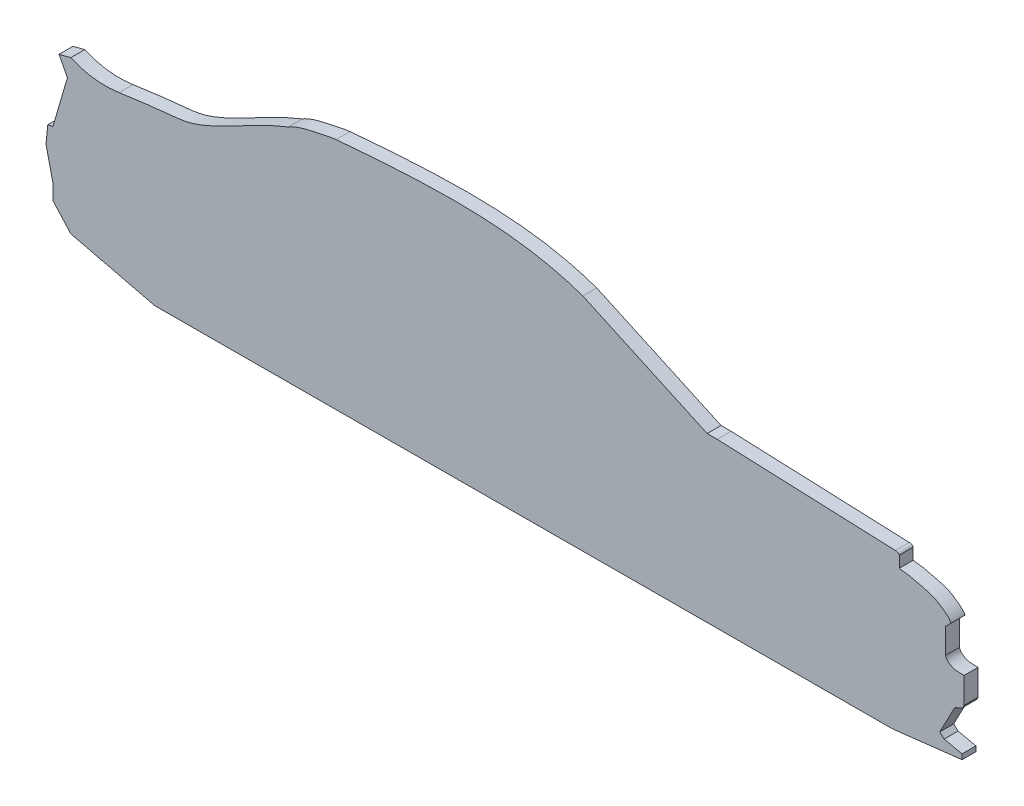
ISO-10303-21;
HEADER;
FILE_DESCRIPTION(('STEP AP214'),'2;1');
FILE_NAME('part.step','',(''),(''),'','','');
FILE_SCHEMA(('AUTOMOTIVE_DESIGN { 1 0 10303 214 1 1 1 1 }'));
ENDSEC;
DATA;
#1=APPLICATION_CONTEXT('core data for automotive mechanical design processes');
#2=APPLICATION_PROTOCOL_DEFINITION('international standard','automotive_design',2000,#1);
#3=PRODUCT_CONTEXT('',#1,'mechanical');
#4=PRODUCT('Part','Part','',(#3));
#5=PRODUCT_RELATED_PRODUCT_CATEGORY('part','',(#4));
#6=PRODUCT_DEFINITION_FORMATION('','',#4);
#7=PRODUCT_DEFINITION_CONTEXT('part definition',#1,'design');
#8=PRODUCT_DEFINITION('design','',#6,#7);
#9=PRODUCT_DEFINITION_SHAPE('','',#8);
#10=(LENGTH_UNIT() NAMED_UNIT(*) SI_UNIT(.MILLI.,.METRE.));
#11=(NAMED_UNIT(*) PLANE_ANGLE_UNIT() SI_UNIT($,.RADIAN.));
#12=(NAMED_UNIT(*) SI_UNIT($,.STERADIAN.) SOLID_ANGLE_UNIT());
#13=UNCERTAINTY_MEASURE_WITH_UNIT(LENGTH_MEASURE(1.E-05),#10,'distance_accuracy_value','');
#14=(GEOMETRIC_REPRESENTATION_CONTEXT(3) GLOBAL_UNCERTAINTY_ASSIGNED_CONTEXT((#13)) GLOBAL_UNIT_ASSIGNED_CONTEXT((#10,
#11,#12)) REPRESENTATION_CONTEXT('',''));
#15=CARTESIAN_POINT('',(0.,0.,0.));
#16=DIRECTION('',(0.,0.,1.));
#17=DIRECTION('',(1.,0.,0.));
#18=AXIS2_PLACEMENT_3D('',#15,#16,#17);
#19=CARTESIAN_POINT('',(58.7825864344325,61.387920700092,3.18));
#20=CARTESIAN_POINT('',(59.9553412007524,62.0984473264359,3.18));
#21=CARTESIAN_POINT('',(61.6811980838709,62.6757230916201,3.18));
#22=CARTESIAN_POINT('',(64.0271999588958,63.266819742886,3.18));
#23=CARTESIAN_POINT('',(66.6443782820778,63.7786861853201,3.18));
#24=CARTESIAN_POINT('',(68.8081257342653,64.309426525435,3.18));
#25=CARTESIAN_POINT('',(70.4249234095868,64.4201904919745,3.18));
#26=B_SPLINE_CURVE_WITH_KNOTS('',3,(#19,#20,#21,#22,#23,#24,#25),.UNSPECIFIED.,.F.,.F.,(4,1,1,1,
4),(0.,0.33868380467163,0.447560598695992,0.600475935578694,1.),.UNSPECIFIED.);
#27=DIRECTION('',(0.,0.,-1.));
#28=VECTOR('',#27,1.);
#29=SURFACE_OF_LINEAR_EXTRUSION('',#26,#28);
#30=CARTESIAN_POINT('',(58.7825864344325,61.387920700092,0.));
#31=CARTESIAN_POINT('',(59.9553412007524,62.0984473264359,0.));
#32=CARTESIAN_POINT('',(61.6811980838709,62.6757230916201,0.));
#33=CARTESIAN_POINT('',(64.0271999588958,63.266819742886,0.));
#34=CARTESIAN_POINT('',(66.6443782820778,63.7786861853201,0.));
#35=CARTESIAN_POINT('',(68.8081257342653,64.309426525435,0.));
#36=CARTESIAN_POINT('',(70.4249234095868,64.4201904919745,0.));
#37=B_SPLINE_CURVE_WITH_KNOTS('',3,(#30,#31,#32,#33,#34,#35,#36),.UNSPECIFIED.,.F.,.F.,(4,1,1,1,
4),(0.,0.33868380467163,0.447560598695992,0.600475935578694,1.),.UNSPECIFIED.);
#38=CARTESIAN_POINT('',(58.7825864344325,61.387920700092,0.));
#39=VERTEX_POINT('',#38);
#40=CARTESIAN_POINT('',(69.7482461927959,64.3584538222527,0.));
#41=VERTEX_POINT('',#40);
#42=EDGE_CURVE('E267',#39,#41,#37,.T.);
#43=ORIENTED_EDGE('',*,*,#42,.F.);
#44=DIRECTION('',(0.,0.,-1.));
#45=VECTOR('',#44,1.);
#46=CARTESIAN_POINT('',(58.7825864344325,61.387920700092,3.18));
#47=LINE('',#46,#45);
#48=CARTESIAN_POINT('',(58.7825864344325,61.387920700092,3.18));
#49=VERTEX_POINT('',#48);
#50=EDGE_CURVE('E11',#49,#39,#47,.T.);
#51=ORIENTED_EDGE('',*,*,#50,.F.);
#52=CARTESIAN_POINT('',(69.7482461927959,64.3584538222527,3.18));
#53=VERTEX_POINT('',#52);
#54=EDGE_CURVE('E485',#49,#53,#26,.T.);
#55=ORIENTED_EDGE('',*,*,#54,.T.);
#56=DIRECTION('',(0.,0.,-1.));
#57=VECTOR('',#56,1.);
#58=CARTESIAN_POINT('',(69.7482461927959,64.3584538222527,3.18));
#59=LINE('',#58,#57);
#60=EDGE_CURVE('E55',#53,#41,#59,.T.);
#61=ORIENTED_EDGE('',*,*,#60,.T.);
#62=EDGE_LOOP('',(#43,#51,#55,#61));
#63=FACE_BOUND('',#62,.T.);
#64=ADVANCED_FACE('F38',(#63),#29,.T.);
#65=CARTESIAN_POINT('',(20.1338269851529,48.8536857864713,3.18));
#66=CARTESIAN_POINT('',(23.9469691753332,49.4560220016771,3.18));
#67=CARTESIAN_POINT('',(28.8451837878007,49.9697702808251,3.18));
#68=CARTESIAN_POINT('',(34.0927913072582,50.5052069747191,3.18));
#69=CARTESIAN_POINT('',(36.0038570365803,50.8803667682891,3.18));
#70=CARTESIAN_POINT('',(39.5982478391194,51.9068643842101,3.18));
#71=CARTESIAN_POINT('',(47.1758600339758,55.7320148153098,3.18));
#72=CARTESIAN_POINT('',(54.0850133671124,59.5061773140621,3.18));
#73=CARTESIAN_POINT('',(58.7825864344325,61.387920700092,3.18));
#74=B_SPLINE_CURVE_WITH_KNOTS('',3,(#65,#66,#67,#68,#69,#70,#71,#72,#73),.UNSPECIFIED.,.F.,.F.,
(4,1,1,1,1,1,4),(0.,0.28145469508974,0.359726600719177,0.384533668839524,0.423485214281698,
0.632085306350574,1.),.UNSPECIFIED.);
#75=DIRECTION('',(0.,0.,-1.));
#76=VECTOR('',#75,1.);
#77=SURFACE_OF_LINEAR_EXTRUSION('',#74,#76);
#78=CARTESIAN_POINT('',(20.1338269851529,48.8536857864713,0.));
#79=CARTESIAN_POINT('',(23.9469691753332,49.4560220016771,0.));
#80=CARTESIAN_POINT('',(28.8451837878007,49.9697702808251,0.));
#81=CARTESIAN_POINT('',(34.0927913072582,50.5052069747191,0.));
#82=CARTESIAN_POINT('',(36.0038570365803,50.8803667682891,0.));
#83=CARTESIAN_POINT('',(39.5982478391194,51.9068643842101,0.));
#84=CARTESIAN_POINT('',(47.1758600339758,55.7320148153098,0.));
#85=CARTESIAN_POINT('',(54.0850133671124,59.5061773140621,0.));
#86=CARTESIAN_POINT('',(58.7825864344325,61.387920700092,0.));
#87=B_SPLINE_CURVE_WITH_KNOTS('',3,(#78,#79,#80,#81,#82,#83,#84,#85,#86),.UNSPECIFIED.,.F.,.F.,
(4,1,1,1,1,1,4),(0.,0.28145469508974,0.359726600719177,0.384533668839524,0.423485214281698,
0.632085306350574,1.),.UNSPECIFIED.);
#88=CARTESIAN_POINT('',(20.1338269851529,48.8536857864713,0.));
#89=VERTEX_POINT('',#88);
#90=EDGE_CURVE('E375',#89,#39,#87,.T.);
#91=ORIENTED_EDGE('',*,*,#90,.F.);
#92=DIRECTION('',(0.,0.,-1.));
#93=VECTOR('',#92,1.);
#94=CARTESIAN_POINT('',(20.1338269851529,48.8536857864713,3.18));
#95=LINE('',#94,#93);
#96=CARTESIAN_POINT('',(20.1338269851529,48.8536857864713,3.18));
#97=VERTEX_POINT('',#96);
#98=EDGE_CURVE('E47',#97,#89,#95,.T.);
#99=ORIENTED_EDGE('',*,*,#98,.F.);
#100=EDGE_CURVE('E489',#97,#49,#74,.T.);
#101=ORIENTED_EDGE('',*,*,#100,.T.);
#102=ORIENTED_EDGE('',*,*,#50,.T.);
#103=EDGE_LOOP('',(#91,#99,#101,#102));
#104=FACE_BOUND('',#103,.T.);
#105=ADVANCED_FACE('F376',(#104),#77,.T.);
#106=CARTESIAN_POINT('',(9.07850141008406,50.2520797955255,3.18));
#107=CARTESIAN_POINT('',(14.2515378182842,47.9791834646523,3.18));
#108=CARTESIAN_POINT('',(20.1338269851529,48.8536857864713,3.18));
#109=B_SPLINE_CURVE_WITH_KNOTS('',2,(#106,#107,#108),.UNSPECIFIED.,.F.,.F.,(3,3),(0.,1.),.UNSPECIFIED.);
#110=DIRECTION('',(0.,0.,-1.));
#111=VECTOR('',#110,1.);
#112=SURFACE_OF_LINEAR_EXTRUSION('',#109,#111);
#113=CARTESIAN_POINT('',(9.07850141008406,50.2520797955255,0.));
#114=CARTESIAN_POINT('',(14.2515378182842,47.9791834646523,0.));
#115=CARTESIAN_POINT('',(20.1338269851529,48.8536857864713,0.));
#116=B_SPLINE_CURVE_WITH_KNOTS('',2,(#113,#114,#115),.UNSPECIFIED.,.F.,.F.,(3,3),(0.,1.),.UNSPECIFIED.);
#117=CARTESIAN_POINT('',(9.07850141008405,50.2520797955255,0.));
#118=VERTEX_POINT('',#117);
#119=EDGE_CURVE('E367',#118,#89,#116,.T.);
#120=ORIENTED_EDGE('',*,*,#119,.F.);
#121=DIRECTION('',(0.,0.,-1.));
#122=VECTOR('',#121,1.);
#123=CARTESIAN_POINT('',(9.07850141008405,50.2520797955255,3.18));
#124=LINE('',#123,#122);
#125=CARTESIAN_POINT('',(9.07850141008405,50.2520797955255,3.18));
#126=VERTEX_POINT('',#125);
#127=EDGE_CURVE('E360',#126,#118,#124,.T.);
#128=ORIENTED_EDGE('',*,*,#127,.F.);
#129=EDGE_CURVE('E370',#126,#97,#109,.T.);
#130=ORIENTED_EDGE('',*,*,#129,.T.);
#131=ORIENTED_EDGE('',*,*,#98,.T.);
#132=EDGE_LOOP('',(#120,#128,#130,#131));
#133=FACE_BOUND('',#132,.T.);
#134=ADVANCED_FACE('F365',(#133),#112,.T.);
#135=CARTESIAN_POINT('',(-11.4022231375135,45.0707657578569,3.18));
#136=DIRECTION('',(-0.245258183588713,0.969457798660037,0.));
#137=DIRECTION('',(-0.969457798660037,-0.245258183588713,0.));
#138=AXIS2_PLACEMENT_3D('',#135,#136,#137);
#139=PLANE('',#138);
#140=DIRECTION('',(0.969457798660037,0.245258183588713,0.));
#141=VECTOR('',#140,1.);
#142=CARTESIAN_POINT('',(-11.4022231375135,45.0707657578569,0.));
#143=LINE('',#142,#141);
#144=CARTESIAN_POINT('',(6.38957921904648,49.5718230857474,0.));
#145=VERTEX_POINT('',#144);
#146=EDGE_CURVE('E380',#145,#118,#143,.T.);
#147=ORIENTED_EDGE('',*,*,#146,.F.);
#148=DIRECTION('',(0.,0.,-1.));
#149=VECTOR('',#148,1.);
#150=CARTESIAN_POINT('',(6.38957921904648,49.5718230857474,3.18));
#151=LINE('',#150,#149);
#152=CARTESIAN_POINT('',(6.38957921904648,49.5718230857474,3.18));
#153=VERTEX_POINT('',#152);
#154=EDGE_CURVE('E358',#153,#145,#151,.T.);
#155=ORIENTED_EDGE('',*,*,#154,.F.);
#156=DIRECTION('',(0.969457798660037,0.245258183588713,0.));
#157=VECTOR('',#156,1.);
#158=CARTESIAN_POINT('',(-11.4022231375135,45.0707657578569,3.18));
#159=LINE('',#158,#157);
#160=EDGE_CURVE('E896',#153,#126,#159,.T.);
#161=ORIENTED_EDGE('',*,*,#160,.T.);
#162=ORIENTED_EDGE('',*,*,#127,.T.);
#163=EDGE_LOOP('',(#147,#155,#161,#162));
#164=FACE_BOUND('',#163,.T.);
#165=ADVANCED_FACE('F512',(#164),#139,.T.);
#166=CARTESIAN_POINT('',(25.3008631133521,13.1295996946262,3.18));
#167=DIRECTION('',(-0.887602037197299,-0.460611141379803,0.));
#168=DIRECTION('',(0.460611141379803,-0.887602037197299,0.));
#169=AXIS2_PLACEMENT_3D('',#166,#167,#168);
#170=PLANE('',#169);
#171=DIRECTION('',(-0.460611141379803,0.887602037197299,0.));
#172=VECTOR('',#171,1.);
#173=CARTESIAN_POINT('',(25.3008631133521,13.1295996946262,0.));
#174=LINE('',#173,#172);
#175=CARTESIAN_POINT('',(8.3048699813304,45.8810396250264,0.));
#176=VERTEX_POINT('',#175);
#177=EDGE_CURVE('E382',#176,#145,#174,.T.);
#178=ORIENTED_EDGE('',*,*,#177,.F.);
#179=DIRECTION('',(0.,0.,-1.));
#180=VECTOR('',#179,1.);
#181=CARTESIAN_POINT('',(8.3048699813304,45.8810396250264,3.18));
#182=LINE('',#181,#180);
#183=CARTESIAN_POINT('',(8.3048699813304,45.8810396250264,3.18));
#184=VERTEX_POINT('',#183);
#185=EDGE_CURVE('E356',#184,#176,#182,.T.);
#186=ORIENTED_EDGE('',*,*,#185,.F.);
#187=DIRECTION('',(-0.460611141379803,0.887602037197299,0.));
#188=VECTOR('',#187,1.);
#189=CARTESIAN_POINT('',(25.3008631133521,13.1295996946262,3.18));
#190=LINE('',#189,#188);
#191=EDGE_CURVE('E893',#184,#153,#190,.T.);
#192=ORIENTED_EDGE('',*,*,#191,.T.);
#193=ORIENTED_EDGE('',*,*,#154,.T.);
#194=EDGE_LOOP('',(#178,#186,#192,#193));
#195=FACE_BOUND('',#194,.T.);
#196=ADVANCED_FACE('F515',(#195),#170,.T.);
#197=CARTESIAN_POINT('',(-4.74424207932047,1.39152209260978,3.18));
#198=DIRECTION('',(-0.959575659856589,0.281450800337808,0.));
#199=DIRECTION('',(-0.281450800337808,-0.959575659856589,0.));
#200=AXIS2_PLACEMENT_3D('',#197,#198,#199);
#201=PLANE('',#200);
#202=DIRECTION('',(0.281450800337808,0.959575659856589,0.));
#203=VECTOR('',#202,1.);
#204=CARTESIAN_POINT('',(-4.74424207932047,1.39152209260978,0.));
#205=LINE('',#204,#203);
#206=CARTESIAN_POINT('',(5.0001251964602,34.613874444493,0.));
#207=VERTEX_POINT('',#206);
#208=EDGE_CURVE('E393',#207,#176,#205,.T.);
#209=ORIENTED_EDGE('',*,*,#208,.F.);
#210=DIRECTION('',(0.,0.,-1.));
#211=VECTOR('',#210,1.);
#212=CARTESIAN_POINT('',(5.0001251964602,34.613874444493,3.18));
#213=LINE('',#212,#211);
#214=CARTESIAN_POINT('',(5.0001251964602,34.613874444493,3.18));
#215=VERTEX_POINT('',#214);
#216=EDGE_CURVE('E354',#215,#207,#213,.T.);
#217=ORIENTED_EDGE('',*,*,#216,.F.);
#218=DIRECTION('',(0.281450800337808,0.959575659856589,0.));
#219=VECTOR('',#218,1.);
#220=CARTESIAN_POINT('',(-4.74424207932047,1.39152209260978,3.18));
#221=LINE('',#220,#219);
#222=EDGE_CURVE('E890',#215,#184,#221,.T.);
#223=ORIENTED_EDGE('',*,*,#222,.T.);
#224=ORIENTED_EDGE('',*,*,#185,.T.);
#225=EDGE_LOOP('',(#209,#217,#223,#224));
#226=FACE_BOUND('',#225,.T.);
#227=ADVANCED_FACE('F519',(#226),#201,.T.);
#228=CARTESIAN_POINT('',(-7.33228996269003,31.7674085882711,3.18));
#229=DIRECTION('',(-0.224898806584016,0.974382125655579,0.));
#230=DIRECTION('',(-0.974382125655579,-0.224898806584016,0.));
#231=AXIS2_PLACEMENT_3D('',#228,#229,#230);
#232=PLANE('',#231);
#233=DIRECTION('',(0.974382125655579,0.224898806584016,0.));
#234=VECTOR('',#233,1.);
#235=CARTESIAN_POINT('',(-7.33228996269003,31.7674085882711,0.));
#236=LINE('',#235,#234);
#237=CARTESIAN_POINT('',(3.81150587652712,34.3395271843194,0.));
#238=VERTEX_POINT('',#237);
#239=EDGE_CURVE('E396',#238,#207,#236,.T.);
#240=ORIENTED_EDGE('',*,*,#239,.F.);
#241=DIRECTION('',(0.,0.,-1.));
#242=VECTOR('',#241,1.);
#243=CARTESIAN_POINT('',(3.81150587652712,34.3395271843194,3.18));
#244=LINE('',#243,#242);
#245=CARTESIAN_POINT('',(3.81150587652712,34.3395271843194,3.18));
#246=VERTEX_POINT('',#245);
#247=EDGE_CURVE('E352',#246,#238,#244,.T.);
#248=ORIENTED_EDGE('',*,*,#247,.F.);
#249=DIRECTION('',(0.974382125655579,0.224898806584016,0.));
#250=VECTOR('',#249,1.);
#251=CARTESIAN_POINT('',(-7.33228996269003,31.7674085882711,3.18));
#252=LINE('',#251,#250);
#253=EDGE_CURVE('E886',#246,#215,#252,.T.);
#254=ORIENTED_EDGE('',*,*,#253,.T.);
#255=ORIENTED_EDGE('',*,*,#216,.T.);
#256=EDGE_LOOP('',(#240,#248,#254,#255));
#257=FACE_BOUND('',#256,.T.);
#258=ADVANCED_FACE('F523',(#257),#232,.T.);
#259=CARTESIAN_POINT('',(0.39935996381265,-0.0396366379144991,3.18));
#260=DIRECTION('',(-0.995110770644322,0.0987651464215146,0.));
#261=DIRECTION('',(-0.0987651464215146,-0.995110770644322,0.));
#262=AXIS2_PLACEMENT_3D('',#259,#260,#261);
#263=PLANE('',#262);
#264=DIRECTION('',(0.0987651464215146,0.995110770644322,0.));
#265=VECTOR('',#264,1.);
#266=CARTESIAN_POINT('',(0.39935996381265,-0.0396366379144991,0.));
#267=LINE('',#266,#265);
#268=CARTESIAN_POINT('',(3.40814163254777,30.2754203792368,0.));
#269=VERTEX_POINT('',#268);
#270=EDGE_CURVE('E399',#269,#238,#267,.T.);
#271=ORIENTED_EDGE('',*,*,#270,.F.);
#272=DIRECTION('',(0.,0.,-1.));
#273=VECTOR('',#272,1.);
#274=CARTESIAN_POINT('',(3.40814163254777,30.2754203792368,3.18));
#275=LINE('',#274,#273);
#276=CARTESIAN_POINT('',(3.40814163254777,30.2754203792368,3.18));
#277=VERTEX_POINT('',#276);
#278=EDGE_CURVE('E350',#277,#269,#275,.T.);
#279=ORIENTED_EDGE('',*,*,#278,.F.);
#280=DIRECTION('',(0.0987651464215146,0.995110770644322,0.));
#281=VECTOR('',#280,1.);
#282=CARTESIAN_POINT('',(0.39935996381265,-0.0396366379144991,3.18));
#283=LINE('',#282,#281);
#284=EDGE_CURVE('E901',#277,#246,#283,.T.);
#285=ORIENTED_EDGE('',*,*,#284,.T.);
#286=ORIENTED_EDGE('',*,*,#247,.T.);
#287=EDGE_LOOP('',(#271,#279,#285,#286));
#288=FACE_BOUND('',#287,.T.);
#289=ADVANCED_FACE('F527',(#288),#263,.T.);
#290=CARTESIAN_POINT('',(9.8702358402127,2.27816603231829,3.18));
#291=DIRECTION('',(-0.974382125655579,-0.224898806584017,0.));
#292=DIRECTION('',(0.224898806584017,-0.974382125655579,0.));
#293=AXIS2_PLACEMENT_3D('',#290,#291,#292);
#294=PLANE('',#293);
#295=DIRECTION('',(-0.224898806584017,0.974382125655579,0.));
#296=VECTOR('',#295,1.);
#297=CARTESIAN_POINT('',(9.8702358402127,2.27816603231829,0.));
#298=LINE('',#297,#296);
#299=CARTESIAN_POINT('',(5.0001251964602,23.378094632716,0.));
#300=VERTEX_POINT('',#299);
#301=EDGE_CURVE('E402',#300,#269,#298,.T.);
#302=ORIENTED_EDGE('',*,*,#301,.F.);
#303=DIRECTION('',(0.,0.,-1.));
#304=VECTOR('',#303,1.);
#305=CARTESIAN_POINT('',(5.0001251964602,23.378094632716,3.18));
#306=LINE('',#305,#304);
#307=CARTESIAN_POINT('',(5.0001251964602,23.378094632716,3.18));
#308=VERTEX_POINT('',#307);
#309=EDGE_CURVE('E348',#308,#300,#306,.T.);
#310=ORIENTED_EDGE('',*,*,#309,.F.);
#311=DIRECTION('',(-0.224898806584017,0.974382125655579,0.));
#312=VECTOR('',#311,1.);
#313=CARTESIAN_POINT('',(9.8702358402127,2.27816603231829,3.18));
#314=LINE('',#313,#312);
#315=EDGE_CURVE('E879',#308,#277,#314,.T.);
#316=ORIENTED_EDGE('',*,*,#315,.T.);
#317=ORIENTED_EDGE('',*,*,#278,.T.);
#318=EDGE_LOOP('',(#302,#310,#316,#317));
#319=FACE_BOUND('',#318,.T.);
#320=ADVANCED_FACE('F531',(#319),#294,.T.);
#321=CARTESIAN_POINT('',(5.0001251964602,0.,3.18));
#322=DIRECTION('',(-1.,0.,0.));
#323=DIRECTION('',(0.,0.,1.));
#324=AXIS2_PLACEMENT_3D('',#321,#322,#323);
#325=PLANE('',#324);
#326=DIRECTION('',(0.,1.,0.));
#327=VECTOR('',#326,1.);
#328=CARTESIAN_POINT('',(5.0001251964602,0.,0.));
#329=LINE('',#328,#327);
#330=CARTESIAN_POINT('',(5.0001251964602,19.8805754375613,0.));
#331=VERTEX_POINT('',#330);
#332=EDGE_CURVE('E405',#331,#300,#329,.T.);
#333=ORIENTED_EDGE('',*,*,#332,.F.);
#334=DIRECTION('',(0.,0.,-1.));
#335=VECTOR('',#334,1.);
#336=CARTESIAN_POINT('',(5.0001251964602,19.8805754375613,3.18));
#337=LINE('',#336,#335);
#338=CARTESIAN_POINT('',(5.0001251964602,19.8805754375613,3.18));
#339=VERTEX_POINT('',#338);
#340=EDGE_CURVE('E346',#339,#331,#337,.T.);
#341=ORIENTED_EDGE('',*,*,#340,.F.);
#342=DIRECTION('',(0.,1.,0.));
#343=VECTOR('',#342,1.);
#344=CARTESIAN_POINT('',(5.0001251964602,0.,3.18));
#345=LINE('',#344,#343);
#346=EDGE_CURVE('E875',#339,#308,#345,.T.);
#347=ORIENTED_EDGE('',*,*,#346,.T.);
#348=ORIENTED_EDGE('',*,*,#309,.T.);
#349=EDGE_LOOP('',(#333,#341,#347,#348));
#350=FACE_BOUND('',#349,.T.);
#351=ADVANCED_FACE('F535',(#350),#325,.T.);
#352=CARTESIAN_POINT('',(12.6408905487857,11.4313415087027,3.18));
#353=DIRECTION('',(-0.741700823334496,-0.67073086157186,0.));
#354=DIRECTION('',(0.67073086157186,-0.741700823334496,0.));
#355=AXIS2_PLACEMENT_3D('',#352,#353,#354);
#356=PLANE('',#355);
#357=DIRECTION('',(-0.67073086157186,0.741700823334496,0.));
#358=VECTOR('',#357,1.);
#359=CARTESIAN_POINT('',(12.6408905487857,11.4313415087027,0.));
#360=LINE('',#359,#358);
#361=CARTESIAN_POINT('',(9.07850141008406,15.3706666666667,0.));
#362=VERTEX_POINT('',#361);
#363=EDGE_CURVE('E408',#362,#331,#360,.T.);
#364=ORIENTED_EDGE('',*,*,#363,.F.);
#365=DIRECTION('',(0.,0.,-1.));
#366=VECTOR('',#365,1.);
#367=CARTESIAN_POINT('',(9.07850141008406,15.3706666666667,3.18));
#368=LINE('',#367,#366);
#369=CARTESIAN_POINT('',(9.07850141008406,15.3706666666667,3.18));
#370=VERTEX_POINT('',#369);
#371=EDGE_CURVE('E344',#370,#362,#368,.T.);
#372=ORIENTED_EDGE('',*,*,#371,.F.);
#373=DIRECTION('',(-0.67073086157186,0.741700823334496,0.));
#374=VECTOR('',#373,1.);
#375=CARTESIAN_POINT('',(12.6408905487857,11.4313415087027,3.18));
#376=LINE('',#375,#374);
#377=EDGE_CURVE('E905',#370,#339,#376,.T.);
#378=ORIENTED_EDGE('',*,*,#377,.T.);
#379=ORIENTED_EDGE('',*,*,#340,.T.);
#380=EDGE_LOOP('',(#364,#372,#378,#379));
#381=FACE_BOUND('',#380,.T.);
#382=ADVANCED_FACE('F539',(#381),#356,.T.);
#383=CARTESIAN_POINT('',(4.00938908371914,16.5953497233249,3.18));
#384=DIRECTION('',(-0.234840611414298,-0.972033892017433,0.));
#385=DIRECTION('',(0.972033892017433,-0.234840611414299,0.));
#386=AXIS2_PLACEMENT_3D('',#383,#384,#385);
#387=PLANE('',#386);
#388=DIRECTION('',(-0.972033892017433,0.234840611414298,0.));
#389=VECTOR('',#388,1.);
#390=CARTESIAN_POINT('',(4.00938908371914,16.5953497233249,0.));
#391=LINE('',#390,#389);
#392=CARTESIAN_POINT('',(28.2441986415733,10.7402889679191,0.));
#393=VERTEX_POINT('',#392);
#394=EDGE_CURVE('E411',#393,#362,#391,.T.);
#395=ORIENTED_EDGE('',*,*,#394,.F.);
#396=DIRECTION('',(0.,0.,-1.));
#397=VECTOR('',#396,1.);
#398=CARTESIAN_POINT('',(28.2441986415733,10.7402889679191,3.18));
#399=LINE('',#398,#397);
#400=CARTESIAN_POINT('',(28.2441986415733,10.7402889679191,3.18));
#401=VERTEX_POINT('',#400);
#402=EDGE_CURVE('E342',#401,#393,#399,.T.);
#403=ORIENTED_EDGE('',*,*,#402,.F.);
#404=DIRECTION('',(-0.972033892017433,0.234840611414298,0.));
#405=VECTOR('',#404,1.);
#406=CARTESIAN_POINT('',(4.00938908371914,16.5953497233249,3.18));
#407=LINE('',#406,#405);
#408=EDGE_CURVE('E868',#401,#370,#407,.T.);
#409=ORIENTED_EDGE('',*,*,#408,.T.);
#410=ORIENTED_EDGE('',*,*,#371,.T.);
#411=EDGE_LOOP('',(#395,#403,#409,#410));
#412=FACE_BOUND('',#411,.T.);
#413=ADVANCED_FACE('F543',(#412),#387,.T.);
#414=CARTESIAN_POINT('',(-0.0344172000520098,10.6488925362904,3.18));
#415=DIRECTION('',(-0.00323198118286353,0.999994777135178,0.));
#416=DIRECTION('',(-0.999994777135178,-0.00323198118286353,0.));
#417=AXIS2_PLACEMENT_3D('',#414,#415,#416);
#418=PLANE('',#417);
#419=DIRECTION('',(0.999994777135178,0.00323198118286353,0.));
#420=VECTOR('',#419,1.);
#421=CARTESIAN_POINT('',(-0.0344172000520098,10.6488925362904,0.));
#422=LINE('',#421,#420);
#423=CARTESIAN_POINT('',(196.984326140587,11.2856567331721,0.));
#424=VERTEX_POINT('',#423);
#425=EDGE_CURVE('E414',#393,#424,#422,.T.);
#426=ORIENTED_EDGE('',*,*,#425,.T.);
#427=DIRECTION('',(0.,0.,-1.));
#428=VECTOR('',#427,1.);
#429=CARTESIAN_POINT('',(196.984326140587,11.2856567331721,3.18));
#430=LINE('',#429,#428);
#431=CARTESIAN_POINT('',(196.984326140587,11.2856567331721,3.18));
#432=VERTEX_POINT('',#431);
#433=EDGE_CURVE('E340',#432,#424,#430,.T.);
#434=ORIENTED_EDGE('',*,*,#433,.F.);
#435=DIRECTION('',(0.999994777135178,0.00323198118286353,0.));
#436=VECTOR('',#435,1.);
#437=CARTESIAN_POINT('',(-0.0344172000520098,10.6488925362904,3.18));
#438=LINE('',#437,#436);
#439=EDGE_CURVE('E908',#401,#432,#438,.T.);
#440=ORIENTED_EDGE('',*,*,#439,.F.);
#441=ORIENTED_EDGE('',*,*,#402,.T.);
#442=EDGE_LOOP('',(#426,#434,#440,#441));
#443=FACE_BOUND('',#442,.T.);
#444=ADVANCED_FACE('F547',(#443),#418,.F.);
#445=CARTESIAN_POINT('',(1.31162485116349,-11.3421853125444,3.18));
#446=DIRECTION('',(0.114875721901543,-0.993379871206176,0.));
#447=DIRECTION('',(0.993379871206176,0.114875721901543,0.));
#448=AXIS2_PLACEMENT_3D('',#445,#446,#447);
#449=PLANE('',#448);
#450=DIRECTION('',(-0.993379871206176,-0.114875721901543,0.));
#451=VECTOR('',#450,1.);
#452=CARTESIAN_POINT('',(1.31162485116349,-11.3421853125444,0.));
#453=LINE('',#452,#451);
#454=CARTESIAN_POINT('',(212.842666666667,13.1195355633138,0.));
#455=VERTEX_POINT('',#454);
#456=EDGE_CURVE('E417',#455,#424,#453,.T.);
#457=ORIENTED_EDGE('',*,*,#456,.F.);
#458=DIRECTION('',(0.,0.,-1.));
#459=VECTOR('',#458,1.);
#460=CARTESIAN_POINT('',(212.842666666667,13.1195355633138,3.18));
#461=LINE('',#460,#459);
#462=CARTESIAN_POINT('',(212.842666666667,13.1195355633138,3.18));
#463=VERTEX_POINT('',#462);
#464=EDGE_CURVE('E338',#463,#455,#461,.T.);
#465=ORIENTED_EDGE('',*,*,#464,.F.);
#466=DIRECTION('',(-0.993379871206176,-0.114875721901543,0.));
#467=VECTOR('',#466,1.);
#468=CARTESIAN_POINT('',(1.31162485116349,-11.3421853125444,3.18));
#469=LINE('',#468,#467);
#470=EDGE_CURVE('E910',#463,#432,#469,.T.);
#471=ORIENTED_EDGE('',*,*,#470,.T.);
#472=ORIENTED_EDGE('',*,*,#433,.T.);
#473=EDGE_LOOP('',(#457,#465,#471,#472));
#474=FACE_BOUND('',#473,.T.);
#475=ADVANCED_FACE('F551',(#474),#449,.T.);
#476=CARTESIAN_POINT('',(212.842666666667,0.,3.18));
#477=DIRECTION('',(1.,0.,0.));
#478=DIRECTION('',(0.,0.,-1.));
#479=AXIS2_PLACEMENT_3D('',#476,#477,#478);
#480=PLANE('',#479);
#481=DIRECTION('',(0.,-1.,0.));
#482=VECTOR('',#481,1.);
#483=CARTESIAN_POINT('',(212.842666666667,0.,0.));
#484=LINE('',#483,#482);
#485=CARTESIAN_POINT('',(212.842666666667,14.2784446215667,0.));
#486=VERTEX_POINT('',#485);
#487=EDGE_CURVE('E420',#486,#455,#484,.T.);
#488=ORIENTED_EDGE('',*,*,#487,.F.);
#489=DIRECTION('',(0.,0.,-1.));
#490=VECTOR('',#489,1.);
#491=CARTESIAN_POINT('',(212.842666666667,14.2784446215667,3.18));
#492=LINE('',#491,#490);
#493=CARTESIAN_POINT('',(212.842666666667,14.2784446215667,3.18));
#494=VERTEX_POINT('',#493);
#495=EDGE_CURVE('E336',#494,#486,#492,.T.);
#496=ORIENTED_EDGE('',*,*,#495,.F.);
#497=DIRECTION('',(0.,-1.,0.));
#498=VECTOR('',#497,1.);
#499=CARTESIAN_POINT('',(212.842666666667,0.,3.18));
#500=LINE('',#499,#498);
#501=EDGE_CURVE('E858',#494,#463,#500,.T.);
#502=ORIENTED_EDGE('',*,*,#501,.T.);
#503=ORIENTED_EDGE('',*,*,#464,.T.);
#504=EDGE_LOOP('',(#488,#496,#502,#503));
#505=FACE_BOUND('',#504,.T.);
#506=ADVANCED_FACE('F555',(#505),#480,.T.);
#507=CARTESIAN_POINT('',(12.5495173195074,57.780616860239,3.18));
#508=DIRECTION('',(0.212244143676169,0.977216671713684,0.));
#509=DIRECTION('',(-0.977216671713684,0.212244143676169,0.));
#510=AXIS2_PLACEMENT_3D('',#507,#508,#509);
#511=PLANE('',#510);
#512=DIRECTION('',(0.977216671713684,-0.212244143676169,0.));
#513=VECTOR('',#512,1.);
#514=CARTESIAN_POINT('',(12.5495173195074,57.780616860239,0.));
#515=LINE('',#514,#513);
#516=CARTESIAN_POINT('',(208.75316699302,15.1666533284188,0.));
#517=VERTEX_POINT('',#516);
#518=EDGE_CURVE('E423',#517,#486,#515,.T.);
#519=ORIENTED_EDGE('',*,*,#518,.F.);
#520=DIRECTION('',(0.,0.,-1.));
#521=VECTOR('',#520,1.);
#522=CARTESIAN_POINT('',(208.75316699302,15.1666533284188,3.18));
#523=LINE('',#522,#521);
#524=CARTESIAN_POINT('',(208.75316699302,15.1666533284188,3.18));
#525=VERTEX_POINT('',#524);
#526=EDGE_CURVE('E334',#525,#517,#523,.T.);
#527=ORIENTED_EDGE('',*,*,#526,.F.);
#528=DIRECTION('',(0.977216671713684,-0.212244143676169,0.));
#529=VECTOR('',#528,1.);
#530=CARTESIAN_POINT('',(12.5495173195074,57.780616860239,3.18));
#531=LINE('',#530,#529);
#532=EDGE_CURVE('E854',#525,#494,#531,.T.);
#533=ORIENTED_EDGE('',*,*,#532,.T.);
#534=ORIENTED_EDGE('',*,*,#495,.T.);
#535=EDGE_LOOP('',(#519,#527,#533,#534));
#536=FACE_BOUND('',#535,.T.);
#537=ADVANCED_FACE('F559',(#536),#511,.T.);
#538=CARTESIAN_POINT('',(104.505471970564,112.234945922878,3.18));
#539=DIRECTION('',(0.681456485667931,0.731858632620476,0.));
#540=DIRECTION('',(-0.731858632620476,0.681456485667931,0.));
#541=AXIS2_PLACEMENT_3D('',#538,#539,#540);
#542=PLANE('',#541);
#543=DIRECTION('',(0.731858632620476,-0.681456485667931,0.));
#544=VECTOR('',#543,1.);
#545=CARTESIAN_POINT('',(104.505471970564,112.234945922878,0.));
#546=LINE('',#545,#544);
#547=CARTESIAN_POINT('',(207.756612292284,16.0945766101434,0.));
#548=VERTEX_POINT('',#547);
#549=EDGE_CURVE('E426',#548,#517,#546,.T.);
#550=ORIENTED_EDGE('',*,*,#549,.F.);
#551=DIRECTION('',(0.,0.,-1.));
#552=VECTOR('',#551,1.);
#553=CARTESIAN_POINT('',(207.756612292284,16.0945766101434,3.18));
#554=LINE('',#553,#552);
#555=CARTESIAN_POINT('',(207.756612292284,16.0945766101434,3.18));
#556=VERTEX_POINT('',#555);
#557=EDGE_CURVE('E332',#556,#548,#554,.T.);
#558=ORIENTED_EDGE('',*,*,#557,.F.);
#559=DIRECTION('',(0.731858632620476,-0.681456485667931,0.));
#560=VECTOR('',#559,1.);
#561=CARTESIAN_POINT('',(104.505471970564,112.234945922878,3.18));
#562=LINE('',#561,#560);
#563=EDGE_CURVE('E913',#556,#525,#562,.T.);
#564=ORIENTED_EDGE('',*,*,#563,.T.);
#565=ORIENTED_EDGE('',*,*,#526,.T.);
#566=EDGE_LOOP('',(#550,#558,#564,#565));
#567=FACE_BOUND('',#566,.T.);
#568=ADVANCED_FACE('F563',(#567),#542,.T.);
#569=CARTESIAN_POINT('',(156.25749658546,-82.0186972043212,3.18));
#570=DIRECTION('',(0.885436353142067,-0.464760652954268,0.));
#571=DIRECTION('',(0.464760652954268,0.885436353142067,0.));
#572=AXIS2_PLACEMENT_3D('',#569,#570,#571);
#573=PLANE('',#572);
#574=DIRECTION('',(-0.464760652954268,-0.885436353142067,0.));
#575=VECTOR('',#574,1.);
#576=CARTESIAN_POINT('',(156.25749658546,-82.0186972043212,0.));
#577=LINE('',#576,#575);
#578=CARTESIAN_POINT('',(211.015778832319,22.3037608798276,0.));
#579=VERTEX_POINT('',#578);
#580=EDGE_CURVE('E429',#579,#548,#577,.T.);
#581=ORIENTED_EDGE('',*,*,#580,.F.);
#582=DIRECTION('',(0.,0.,-1.));
#583=VECTOR('',#582,1.);
#584=CARTESIAN_POINT('',(211.015778832319,22.3037608798276,3.18));
#585=LINE('',#584,#583);
#586=CARTESIAN_POINT('',(211.015778832319,22.3037608798276,3.18));
#587=VERTEX_POINT('',#586);
#588=EDGE_CURVE('E330',#587,#579,#585,.T.);
#589=ORIENTED_EDGE('',*,*,#588,.F.);
#590=DIRECTION('',(-0.464760652954268,-0.885436353142067,0.));
#591=VECTOR('',#590,1.);
#592=CARTESIAN_POINT('',(156.25749658546,-82.0186972043212,3.18));
#593=LINE('',#592,#591);
#594=EDGE_CURVE('E587',#587,#556,#593,.T.);
#595=ORIENTED_EDGE('',*,*,#594,.T.);
#596=ORIENTED_EDGE('',*,*,#557,.T.);
#597=EDGE_LOOP('',(#581,#589,#595,#596));
#598=FACE_BOUND('',#597,.T.);
#599=ADVANCED_FACE('F567',(#598),#573,.T.);
#600=CARTESIAN_POINT('',(213.311956775186,24.1360942269111,3.18));
#601=CARTESIAN_POINT('',(213.208583454964,23.8622220482375,3.18));
#602=CARTESIAN_POINT('',(212.95727908795,23.3800627355938,3.18));
#603=CARTESIAN_POINT('',(212.308333510234,23.0293374411312,3.18));
#604=CARTESIAN_POINT('',(211.606742708366,22.8604329825108,3.18));
#605=CARTESIAN_POINT('',(211.18355106596,22.6233912826359,3.18));
#606=CARTESIAN_POINT('',(211.015778832319,22.3037608798275,3.18));
#607=B_SPLINE_CURVE_WITH_KNOTS('',3,(#600,#601,#602,#603,#604,#605,#606),.UNSPECIFIED.,.F.,.F.,
(4,1,1,1,4),(0.,0.295149858496401,0.505508593038205,0.7072139325662,1.),.UNSPECIFIED.);
#608=DIRECTION('',(0.,0.,-1.));
#609=VECTOR('',#608,1.);
#610=SURFACE_OF_LINEAR_EXTRUSION('',#607,#609);
#611=CARTESIAN_POINT('',(213.311956775186,24.1360942269111,0.));
#612=CARTESIAN_POINT('',(213.208583454964,23.8622220482375,0.));
#613=CARTESIAN_POINT('',(212.95727908795,23.3800627355938,0.));
#614=CARTESIAN_POINT('',(212.308333510234,23.0293374411312,0.));
#615=CARTESIAN_POINT('',(211.606742708366,22.8604329825108,0.));
#616=CARTESIAN_POINT('',(211.18355106596,22.6233912826359,0.));
#617=CARTESIAN_POINT('',(211.015778832319,22.3037608798275,0.));
#618=B_SPLINE_CURVE_WITH_KNOTS('',3,(#611,#612,#613,#614,#615,#616,#617),.UNSPECIFIED.,.F.,.F.,
(4,1,1,1,4),(0.,0.295149858496401,0.505508593038205,0.7072139325662,1.),.UNSPECIFIED.);
#619=CARTESIAN_POINT('',(213.311956775186,24.1360942269111,0.));
#620=VERTEX_POINT('',#619);
#621=EDGE_CURVE('E432',#620,#579,#618,.T.);
#622=ORIENTED_EDGE('',*,*,#621,.F.);
#623=DIRECTION('',(0.,0.,-1.));
#624=VECTOR('',#623,1.);
#625=CARTESIAN_POINT('',(213.311956775186,24.1360942269111,3.18));
#626=LINE('',#625,#624);
#627=CARTESIAN_POINT('',(213.311956775186,24.1360942269111,3.18));
#628=VERTEX_POINT('',#627);
#629=EDGE_CURVE('E328',#628,#620,#626,.T.);
#630=ORIENTED_EDGE('',*,*,#629,.F.);
#631=EDGE_CURVE('E579',#628,#587,#607,.T.);
#632=ORIENTED_EDGE('',*,*,#631,.T.);
#633=ORIENTED_EDGE('',*,*,#588,.T.);
#634=EDGE_LOOP('',(#622,#630,#632,#633));
#635=FACE_BOUND('',#634,.T.);
#636=ADVANCED_FACE('F571',(#635),#610,.T.);
#637=CARTESIAN_POINT('',(213.311956775186,0.,3.18));
#638=DIRECTION('',(1.,0.,0.));
#639=DIRECTION('',(0.,0.,-1.));
#640=AXIS2_PLACEMENT_3D('',#637,#638,#639);
#641=PLANE('',#640);
#642=DIRECTION('',(0.,-1.,0.));
#643=VECTOR('',#642,1.);
#644=CARTESIAN_POINT('',(213.311956775186,0.,0.));
#645=LINE('',#644,#643);
#646=CARTESIAN_POINT('',(213.311956775186,30.0524315911694,0.));
#647=VERTEX_POINT('',#646);
#648=EDGE_CURVE('E437',#647,#620,#645,.T.);
#649=ORIENTED_EDGE('',*,*,#648,.F.);
#650=DIRECTION('',(0.,0.,-1.));
#651=VECTOR('',#650,1.);
#652=CARTESIAN_POINT('',(213.311956775186,30.0524315911694,3.18));
#653=LINE('',#652,#651);
#654=CARTESIAN_POINT('',(213.311956775186,30.0524315911694,3.18));
#655=VERTEX_POINT('',#654);
#656=EDGE_CURVE('E326',#655,#647,#653,.T.);
#657=ORIENTED_EDGE('',*,*,#656,.F.);
#658=DIRECTION('',(0.,-1.,0.));
#659=VECTOR('',#658,1.);
#660=CARTESIAN_POINT('',(213.311956775186,0.,3.18));
#661=LINE('',#660,#659);
#662=EDGE_CURVE('E586',#655,#628,#661,.T.);
#663=ORIENTED_EDGE('',*,*,#662,.T.);
#664=ORIENTED_EDGE('',*,*,#629,.T.);
#665=EDGE_LOOP('',(#649,#657,#663,#664));
#666=FACE_BOUND('',#665,.T.);
#667=ADVANCED_FACE('F576',(#666),#641,.T.);
#668=CARTESIAN_POINT('',(209.096417687576,31.9069341091698,3.18));
#669=CARTESIAN_POINT('',(209.232301931015,31.1984936876893,3.18));
#670=CARTESIAN_POINT('',(209.920582822117,30.6804375276798,3.18));
#671=CARTESIAN_POINT('',(211.427560223815,29.9869430499981,3.18));
#672=CARTESIAN_POINT('',(212.520853082694,30.0887624337777,3.18));
#673=CARTESIAN_POINT('',(213.311956775186,30.0524315911694,3.18));
#674=B_SPLINE_CURVE_WITH_KNOTS('',3,(#668,#669,#670,#671,#672,#673),.UNSPECIFIED.,.F.,.F.,(4,1,
1,4),(0.,0.389815245761473,0.499049523534849,1.),.UNSPECIFIED.);
#675=DIRECTION('',(0.,0.,-1.));
#676=VECTOR('',#675,1.);
#677=SURFACE_OF_LINEAR_EXTRUSION('',#674,#676);
#678=CARTESIAN_POINT('',(209.096417687576,31.9069341091698,0.));
#679=CARTESIAN_POINT('',(209.232301931015,31.1984936876893,0.));
#680=CARTESIAN_POINT('',(209.920582822117,30.6804375276798,0.));
#681=CARTESIAN_POINT('',(211.427560223815,29.9869430499981,0.));
#682=CARTESIAN_POINT('',(212.520853082694,30.0887624337777,0.));
#683=CARTESIAN_POINT('',(213.311956775186,30.0524315911694,0.));
#684=B_SPLINE_CURVE_WITH_KNOTS('',3,(#678,#679,#680,#681,#682,#683),.UNSPECIFIED.,.F.,.F.,(4,1,
1,4),(0.,0.389815245761473,0.499049523534849,1.),.UNSPECIFIED.);
#685=CARTESIAN_POINT('',(209.096417687576,31.9069341091698,0.));
#686=VERTEX_POINT('',#685);
#687=EDGE_CURVE('E443',#686,#647,#684,.T.);
#688=ORIENTED_EDGE('',*,*,#687,.F.);
#689=DIRECTION('',(0.,0.,-1.));
#690=VECTOR('',#689,1.);
#691=CARTESIAN_POINT('',(209.096417687576,31.9069341091698,3.18));
#692=LINE('',#691,#690);
#693=CARTESIAN_POINT('',(209.096417687576,31.9069341091698,3.18));
#694=VERTEX_POINT('',#693);
#695=EDGE_CURVE('E324',#694,#686,#692,.T.);
#696=ORIENTED_EDGE('',*,*,#695,.F.);
#697=EDGE_CURVE('E594',#694,#655,#674,.T.);
#698=ORIENTED_EDGE('',*,*,#697,.T.);
#699=ORIENTED_EDGE('',*,*,#656,.T.);
#700=EDGE_LOOP('',(#688,#696,#698,#699));
#701=FACE_BOUND('',#700,.T.);
#702=ADVANCED_FACE('F605',(#701),#677,.T.);
#703=CARTESIAN_POINT('',(209.096417687576,0.,3.18));
#704=DIRECTION('',(1.,0.,0.));
#705=DIRECTION('',(0.,0.,-1.));
#706=AXIS2_PLACEMENT_3D('',#703,#704,#705);
#707=PLANE('',#706);
#708=DIRECTION('',(0.,-1.,0.));
#709=VECTOR('',#708,1.);
#710=CARTESIAN_POINT('',(209.096417687576,0.,0.));
#711=LINE('',#710,#709);
#712=CARTESIAN_POINT('',(209.096417687576,37.6721265369038,0.));
#713=VERTEX_POINT('',#712);
#714=EDGE_CURVE('E448',#713,#686,#711,.T.);
#715=ORIENTED_EDGE('',*,*,#714,.F.);
#716=DIRECTION('',(0.,0.,-1.));
#717=VECTOR('',#716,1.);
#718=CARTESIAN_POINT('',(209.096417687576,37.6721265369038,3.18));
#719=LINE('',#718,#717);
#720=CARTESIAN_POINT('',(209.096417687576,37.6721265369038,3.18));
#721=VERTEX_POINT('',#720);
#722=EDGE_CURVE('E322',#721,#713,#719,.T.);
#723=ORIENTED_EDGE('',*,*,#722,.F.);
#724=DIRECTION('',(0.,-1.,0.));
#725=VECTOR('',#724,1.);
#726=CARTESIAN_POINT('',(209.096417687576,0.,3.18));
#727=LINE('',#726,#725);
#728=EDGE_CURVE('E600',#721,#694,#727,.T.);
#729=ORIENTED_EDGE('',*,*,#728,.T.);
#730=ORIENTED_EDGE('',*,*,#695,.T.);
#731=EDGE_LOOP('',(#715,#723,#729,#730));
#732=FACE_BOUND('',#731,.T.);
#733=ADVANCED_FACE('F608',(#732),#707,.T.);
#734=CARTESIAN_POINT('',(85.7121455753372,-85.7121455753363,3.18));
#735=DIRECTION('',(0.707106781186551,-0.707106781186544,0.));
#736=DIRECTION('',(0.707106781186544,0.707106781186551,0.));
#737=AXIS2_PLACEMENT_3D('',#734,#735,#736);
#738=PLANE('',#737);
#739=DIRECTION('',(-0.707106781186544,-0.707106781186551,0.));
#740=VECTOR('',#739,1.);
#741=CARTESIAN_POINT('',(85.7121455753372,-85.7121455753363,0.));
#742=LINE('',#741,#740);
#743=CARTESIAN_POINT('',(210.346467513773,38.9221763631009,0.));
#744=VERTEX_POINT('',#743);
#745=EDGE_CURVE('E454',#744,#713,#742,.T.);
#746=ORIENTED_EDGE('',*,*,#745,.F.);
#747=DIRECTION('',(0.,0.,-1.));
#748=VECTOR('',#747,1.);
#749=CARTESIAN_POINT('',(210.346467513773,38.9221763631009,3.18));
#750=LINE('',#749,#748);
#751=CARTESIAN_POINT('',(210.346467513773,38.9221763631009,3.18));
#752=VERTEX_POINT('',#751);
#753=EDGE_CURVE('E320',#752,#744,#750,.T.);
#754=ORIENTED_EDGE('',*,*,#753,.F.);
#755=DIRECTION('',(-0.707106781186544,-0.707106781186551,0.));
#756=VECTOR('',#755,1.);
#757=CARTESIAN_POINT('',(85.7121455753372,-85.7121455753363,3.18));
#758=LINE('',#757,#756);
#759=EDGE_CURVE('E624',#752,#721,#758,.T.);
#760=ORIENTED_EDGE('',*,*,#759,.T.);
#761=ORIENTED_EDGE('',*,*,#722,.T.);
#762=EDGE_LOOP('',(#746,#754,#760,#761));
#763=FACE_BOUND('',#762,.T.);
#764=ADVANCED_FACE('F612',(#763),#738,.T.);
#765=CARTESIAN_POINT('',(198.487796099215,43.8450607428185,3.18));
#766=CARTESIAN_POINT('',(200.154143731162,43.7369546642511,3.18));
#767=CARTESIAN_POINT('',(202.765045449459,43.0829874532504,3.18));
#768=CARTESIAN_POINT('',(206.18299486554,42.2561847470476,3.18));
#769=CARTESIAN_POINT('',(208.528724373944,40.8310883763862,3.18));
#770=CARTESIAN_POINT('',(209.91038317624,39.742707024773,3.18));
#771=CARTESIAN_POINT('',(210.346467513773,38.9221763631009,3.18));
#772=B_SPLINE_CURVE_WITH_KNOTS('',3,(#765,#766,#767,#768,#769,#770,#771),.UNSPECIFIED.,.F.,.F.,
(4,1,1,1,4),(0.,0.376788936080222,0.614454889547942,0.789914739341571,1.),.UNSPECIFIED.);
#773=DIRECTION('',(0.,0.,-1.));
#774=VECTOR('',#773,1.);
#775=SURFACE_OF_LINEAR_EXTRUSION('',#772,#774);
#776=CARTESIAN_POINT('',(198.487796099215,43.8450607428185,0.));
#777=CARTESIAN_POINT('',(200.154143731162,43.7369546642511,0.));
#778=CARTESIAN_POINT('',(202.765045449459,43.0829874532504,0.));
#779=CARTESIAN_POINT('',(206.18299486554,42.2561847470476,0.));
#780=CARTESIAN_POINT('',(208.528724373944,40.8310883763862,0.));
#781=CARTESIAN_POINT('',(209.91038317624,39.742707024773,0.));
#782=CARTESIAN_POINT('',(210.346467513773,38.9221763631009,0.));
#783=B_SPLINE_CURVE_WITH_KNOTS('',3,(#776,#777,#778,#779,#780,#781,#782),.UNSPECIFIED.,.F.,.F.,
(4,1,1,1,4),(0.,0.376788936080222,0.614454889547942,0.789914739341571,1.),.UNSPECIFIED.);
#784=CARTESIAN_POINT('',(198.487796099215,43.8450607428185,0.));
#785=VERTEX_POINT('',#784);
#786=EDGE_CURVE('E457',#785,#744,#783,.T.);
#787=ORIENTED_EDGE('',*,*,#786,.F.);
#788=DIRECTION('',(0.,0.,-1.));
#789=VECTOR('',#788,1.);
#790=CARTESIAN_POINT('',(198.487796099215,43.8450607428185,3.18));
#791=LINE('',#790,#789);
#792=CARTESIAN_POINT('',(198.487796099215,43.8450607428185,3.18));
#793=VERTEX_POINT('',#792);
#794=EDGE_CURVE('E318',#793,#785,#791,.T.);
#795=ORIENTED_EDGE('',*,*,#794,.F.);
#796=EDGE_CURVE('E619',#793,#752,#772,.T.);
#797=ORIENTED_EDGE('',*,*,#796,.T.);
#798=ORIENTED_EDGE('',*,*,#753,.T.);
#799=EDGE_LOOP('',(#787,#795,#797,#798));
#800=FACE_BOUND('',#799,.T.);
#801=ADVANCED_FACE('F615',(#800),#775,.T.);
#802=CARTESIAN_POINT('',(198.487796099215,0.,3.18));
#803=DIRECTION('',(1.,0.,0.));
#804=DIRECTION('',(0.,0.,-1.));
#805=AXIS2_PLACEMENT_3D('',#802,#803,#804);
#806=PLANE('',#805);
#807=DIRECTION('',(0.,-1.,0.));
#808=VECTOR('',#807,1.);
#809=CARTESIAN_POINT('',(198.487796099215,0.,0.));
#810=LINE('',#809,#808);
#811=CARTESIAN_POINT('',(198.487796099215,46.439819768954,0.));
#812=VERTEX_POINT('',#811);
#813=EDGE_CURVE('E462',#812,#785,#810,.T.);
#814=ORIENTED_EDGE('',*,*,#813,.F.);
#815=DIRECTION('',(0.,0.,-1.));
#816=VECTOR('',#815,1.);
#817=CARTESIAN_POINT('',(198.487796099215,46.439819768954,3.18));
#818=LINE('',#817,#816);
#819=CARTESIAN_POINT('',(198.487796099215,46.439819768954,3.18));
#820=VERTEX_POINT('',#819);
#821=EDGE_CURVE('E313',#820,#812,#818,.T.);
#822=ORIENTED_EDGE('',*,*,#821,.F.);
#823=DIRECTION('',(0.,-1.,0.));
#824=VECTOR('',#823,1.);
#825=CARTESIAN_POINT('',(198.487796099215,0.,3.18));
#826=LINE('',#825,#824);
#827=EDGE_CURVE('E302',#820,#793,#826,.T.);
#828=ORIENTED_EDGE('',*,*,#827,.T.);
#829=ORIENTED_EDGE('',*,*,#794,.T.);
#830=EDGE_LOOP('',(#814,#822,#828,#829));
#831=FACE_BOUND('',#830,.T.);
#832=ADVANCED_FACE('F293',(#831),#806,.T.);
#833=CARTESIAN_POINT('',(197.5904889579,46.9296596840194,3.18));
#834=CARTESIAN_POINT('',(197.95817678657,46.9895269364193,3.18));
#835=CARTESIAN_POINT('',(198.336218206113,46.7695144114479,3.18));
#836=CARTESIAN_POINT('',(198.487796099215,46.439819768954,3.18));
#837=B_SPLINE_CURVE_WITH_KNOTS('',3,(#833,#834,#835,#836),.UNSPECIFIED.,.F.,.F.,(4,4),(0.,1.),.UNSPECIFIED.);
#838=DIRECTION('',(0.,0.,-1.));
#839=VECTOR('',#838,1.);
#840=SURFACE_OF_LINEAR_EXTRUSION('',#837,#839);
#841=CARTESIAN_POINT('',(197.5904889579,46.9296596840194,0.));
#842=CARTESIAN_POINT('',(197.95817678657,46.9895269364193,0.));
#843=CARTESIAN_POINT('',(198.336218206113,46.7695144114479,0.));
#844=CARTESIAN_POINT('',(198.487796099215,46.439819768954,0.));
#845=B_SPLINE_CURVE_WITH_KNOTS('',3,(#841,#842,#843,#844),.UNSPECIFIED.,.F.,.F.,(4,4),(0.,1.),.UNSPECIFIED.);
#846=CARTESIAN_POINT('',(197.5904889579,46.9296596840194,0.));
#847=VERTEX_POINT('',#846);
#848=EDGE_CURVE('E468',#847,#812,#845,.T.);
#849=ORIENTED_EDGE('',*,*,#848,.F.);
#850=DIRECTION('',(0.,0.,-1.));
#851=VECTOR('',#850,1.);
#852=CARTESIAN_POINT('',(197.5904889579,46.9296596840194,3.18));
#853=LINE('',#852,#851);
#854=CARTESIAN_POINT('',(197.5904889579,46.9296596840194,3.18));
#855=VERTEX_POINT('',#854);
#856=EDGE_CURVE('E308',#855,#847,#853,.T.);
#857=ORIENTED_EDGE('',*,*,#856,.F.);
#858=EDGE_CURVE('E296',#855,#820,#837,.T.);
#859=ORIENTED_EDGE('',*,*,#858,.T.);
#860=ORIENTED_EDGE('',*,*,#821,.T.);
#861=EDGE_LOOP('',(#849,#857,#859,#860));
#862=FACE_BOUND('',#861,.T.);
#863=ADVANCED_FACE('F288',(#862),#840,.T.);
#864=CARTESIAN_POINT('',(2.21702819400331,54.8295665759284,3.18));
#865=DIRECTION('',(0.0404018881027064,0.999183510391228,0.));
#866=DIRECTION('',(-0.999183510391228,0.0404018881027064,0.));
#867=AXIS2_PLACEMENT_3D('',#864,#865,#866);
#868=PLANE('',#867);
#869=DIRECTION('',(0.999183510391228,-0.0404018881027064,0.));
#870=VECTOR('',#869,1.);
#871=CARTESIAN_POINT('',(2.21702819400331,54.8295665759284,0.));
#872=LINE('',#871,#870);
#873=CARTESIAN_POINT('',(156.874666666667,48.576,0.));
#874=VERTEX_POINT('',#873);
#875=EDGE_CURVE('E311',#874,#847,#872,.T.);
#876=ORIENTED_EDGE('',*,*,#875,.F.);
#877=DIRECTION('',(0.,0.,-1.));
#878=VECTOR('',#877,1.);
#879=CARTESIAN_POINT('',(156.874666666667,48.576,3.18));
#880=LINE('',#879,#878);
#881=CARTESIAN_POINT('',(156.874666666667,48.576,3.18));
#882=VERTEX_POINT('',#881);
#883=EDGE_CURVE('E246',#882,#874,#880,.T.);
#884=ORIENTED_EDGE('',*,*,#883,.F.);
#885=DIRECTION('',(0.999183510391228,-0.0404018881027064,0.));
#886=VECTOR('',#885,1.);
#887=CARTESIAN_POINT('',(2.21702819400331,54.8295665759284,3.18));
#888=LINE('',#887,#886);
#889=EDGE_CURVE('E256',#882,#855,#888,.T.);
#890=ORIENTED_EDGE('',*,*,#889,.T.);
#891=ORIENTED_EDGE('',*,*,#856,.T.);
#892=EDGE_LOOP('',(#876,#884,#890,#891));
#893=FACE_BOUND('',#892,.T.);
#894=ADVANCED_FACE('F285',(#893),#868,.T.);
#895=CARTESIAN_POINT('',(0.,48.576,3.18));
#896=DIRECTION('',(0.,1.,0.));
#897=DIRECTION('',(0.,0.,1.));
#898=AXIS2_PLACEMENT_3D('',#895,#896,#897);
#899=PLANE('',#898);
#900=DIRECTION('',(1.,0.,0.));
#901=VECTOR('',#900,1.);
#902=CARTESIAN_POINT('',(0.,48.576,0.));
#903=LINE('',#902,#901);
#904=CARTESIAN_POINT('',(154.566276862913,48.576,0.));
#905=VERTEX_POINT('',#904);
#906=EDGE_CURVE('E242',#905,#874,#903,.T.);
#907=ORIENTED_EDGE('',*,*,#906,.F.);
#908=DIRECTION('',(0.,0.,-1.));
#909=VECTOR('',#908,1.);
#910=CARTESIAN_POINT('',(154.566276862913,48.576,3.18));
#911=LINE('',#910,#909);
#912=CARTESIAN_POINT('',(154.566276862913,48.576,3.18));
#913=VERTEX_POINT('',#912);
#914=EDGE_CURVE('E237',#913,#905,#911,.T.);
#915=ORIENTED_EDGE('',*,*,#914,.F.);
#916=DIRECTION('',(1.,0.,0.));
#917=VECTOR('',#916,1.);
#918=CARTESIAN_POINT('',(0.,48.576,3.18));
#919=LINE('',#918,#917);
#920=EDGE_CURVE('E240',#913,#882,#919,.T.);
#921=ORIENTED_EDGE('',*,*,#920,.T.);
#922=ORIENTED_EDGE('',*,*,#883,.T.);
#923=EDGE_LOOP('',(#907,#915,#921,#922));
#924=FACE_BOUND('',#923,.T.);
#925=ADVANCED_FACE('F239',(#924),#899,.T.);
#926=CARTESIAN_POINT('',(45.2134907213956,98.6797208133288,3.18));
#927=DIRECTION('',(0.416542678151345,0.909116162697873,0.));
#928=DIRECTION('',(-0.909116162697873,0.416542678151345,0.));
#929=AXIS2_PLACEMENT_3D('',#926,#927,#928);
#930=PLANE('',#929);
#931=DIRECTION('',(0.909116162697873,-0.416542678151345,0.));
#932=VECTOR('',#931,1.);
#933=CARTESIAN_POINT('',(45.2134907213956,98.6797208133288,0.));
#934=LINE('',#933,#932);
#935=CARTESIAN_POINT('',(126.154248001657,61.5939432279149,0.));
#936=VERTEX_POINT('',#935);
#937=EDGE_CURVE('E478',#936,#905,#934,.T.);
#938=ORIENTED_EDGE('',*,*,#937,.F.);
#939=DIRECTION('',(0.,0.,-1.));
#940=VECTOR('',#939,1.);
#941=CARTESIAN_POINT('',(126.154248001657,61.5939432279149,3.18));
#942=LINE('',#941,#940);
#943=CARTESIAN_POINT('',(126.154248001657,61.5939432279149,3.18));
#944=VERTEX_POINT('',#943);
#945=EDGE_CURVE('E146',#944,#936,#942,.T.);
#946=ORIENTED_EDGE('',*,*,#945,.F.);
#947=DIRECTION('',(0.909116162697873,-0.416542678151345,0.));
#948=VECTOR('',#947,1.);
#949=CARTESIAN_POINT('',(45.2134907213956,98.6797208133288,3.18));
#950=LINE('',#949,#948);
#951=EDGE_CURVE('E253',#944,#913,#950,.T.);
#952=ORIENTED_EDGE('',*,*,#951,.T.);
#953=ORIENTED_EDGE('',*,*,#914,.T.);
#954=EDGE_LOOP('',(#938,#946,#952,#953));
#955=FACE_BOUND('',#954,.T.);
#956=ADVANCED_FACE('F258',(#955),#930,.T.);
#957=CARTESIAN_POINT('',(69.7482461927959,64.3584538222527,3.18));
#958=CARTESIAN_POINT('',(69.9737631649263,64.3795208377782,3.18));
#959=CARTESIAN_POINT('',(71.3141571300506,64.501619908035,3.18));
#960=CARTESIAN_POINT('',(74.003845295725,64.7163725813636,3.18));
#961=CARTESIAN_POINT('',(79.1087262204423,65.1366021925231,3.18));
#962=CARTESIAN_POINT('',(96.6447853509023,66.1820604740629,3.18));
#963=CARTESIAN_POINT('',(113.226942998659,66.1037636325823,3.18));
#964=CARTESIAN_POINT('',(126.154248001657,61.5939432279149,3.18));
#965=B_SPLINE_CURVE_WITH_KNOTS('',3,(#957,#958,#959,#960,#961,#962,#963,#964),.UNSPECIFIED.,.F.,
.F.,(4,1,1,1,1,4),(0.0260047293705831,0.0376539624878905,0.0952300392742532,0.16477852469691,
0.301013955768661,1.),.UNSPECIFIED.);
#966=DIRECTION('',(0.,0.,-1.));
#967=VECTOR('',#966,1.);
#968=SURFACE_OF_LINEAR_EXTRUSION('',#965,#967);
#969=CARTESIAN_POINT('',(69.7482461927959,64.3584538222527,0.));
#970=CARTESIAN_POINT('',(69.9737631649263,64.3795208377782,0.));
#971=CARTESIAN_POINT('',(71.3141571300506,64.501619908035,0.));
#972=CARTESIAN_POINT('',(74.003845295725,64.7163725813636,0.));
#973=CARTESIAN_POINT('',(79.1087262204423,65.1366021925231,0.));
#974=CARTESIAN_POINT('',(96.6447853509023,66.1820604740629,0.));
#975=CARTESIAN_POINT('',(113.226942998659,66.1037636325823,0.));
#976=CARTESIAN_POINT('',(126.154248001657,61.5939432279149,0.));
#977=B_SPLINE_CURVE_WITH_KNOTS('',3,(#969,#970,#971,#972,#973,#974,#975,#976),.UNSPECIFIED.,.F.,
.F.,(4,1,1,1,1,4),(0.0260047293705831,0.0376539624878905,0.0952300392742532,0.16477852469691,
0.301013955768661,1.),.UNSPECIFIED.);
#978=EDGE_CURVE('E480',#41,#936,#977,.T.);
#979=ORIENTED_EDGE('',*,*,#978,.F.);
#980=ORIENTED_EDGE('',*,*,#60,.F.);
#981=EDGE_CURVE('E259',#53,#944,#965,.T.);
#982=ORIENTED_EDGE('',*,*,#981,.T.);
#983=ORIENTED_EDGE('',*,*,#945,.T.);
#984=EDGE_LOOP('',(#979,#980,#982,#983));
#985=FACE_BOUND('',#984,.T.);
#986=ADVANCED_FACE('F275',(#985),#968,.T.);
#987=CARTESIAN_POINT('',(0.,0.,3.18));
#988=DIRECTION('',(0.,0.,1.));
#989=DIRECTION('',(1.,0.,0.));
#990=AXIS2_PLACEMENT_3D('',#987,#988,#989);
#991=PLANE('',#990);
#992=ORIENTED_EDGE('',*,*,#54,.F.);
#993=ORIENTED_EDGE('',*,*,#100,.F.);
#994=ORIENTED_EDGE('',*,*,#129,.F.);
#995=ORIENTED_EDGE('',*,*,#160,.F.);
#996=ORIENTED_EDGE('',*,*,#191,.F.);
#997=ORIENTED_EDGE('',*,*,#222,.F.);
#998=ORIENTED_EDGE('',*,*,#253,.F.);
#999=ORIENTED_EDGE('',*,*,#284,.F.);
#1000=ORIENTED_EDGE('',*,*,#315,.F.);
#1001=ORIENTED_EDGE('',*,*,#346,.F.);
#1002=ORIENTED_EDGE('',*,*,#377,.F.);
#1003=ORIENTED_EDGE('',*,*,#408,.F.);
#1004=ORIENTED_EDGE('',*,*,#439,.T.);
#1005=ORIENTED_EDGE('',*,*,#470,.F.);
#1006=ORIENTED_EDGE('',*,*,#501,.F.);
#1007=ORIENTED_EDGE('',*,*,#532,.F.);
#1008=ORIENTED_EDGE('',*,*,#563,.F.);
#1009=ORIENTED_EDGE('',*,*,#594,.F.);
#1010=ORIENTED_EDGE('',*,*,#631,.F.);
#1011=ORIENTED_EDGE('',*,*,#662,.F.);
#1012=ORIENTED_EDGE('',*,*,#697,.F.);
#1013=ORIENTED_EDGE('',*,*,#728,.F.);
#1014=ORIENTED_EDGE('',*,*,#759,.F.);
#1015=ORIENTED_EDGE('',*,*,#796,.F.);
#1016=ORIENTED_EDGE('',*,*,#827,.F.);
#1017=ORIENTED_EDGE('',*,*,#858,.F.);
#1018=ORIENTED_EDGE('',*,*,#889,.F.);
#1019=ORIENTED_EDGE('',*,*,#920,.F.);
#1020=ORIENTED_EDGE('',*,*,#951,.F.);
#1021=ORIENTED_EDGE('',*,*,#981,.F.);
#1022=EDGE_LOOP('',(#992,#993,#994,#995,#996,#997,#998,#999,#1000,#1001,#1002,#1003,#1004,#1005,
#1006,#1007,#1008,#1009,#1010,#1011,#1012,#1013,#1014,#1015,#1016,#1017,#1018,#1019,#1020,#1021));
#1023=FACE_BOUND('',#1022,.T.);
#1024=ADVANCED_FACE('F251',(#1023),#991,.T.);
#1025=CARTESIAN_POINT('',(0.,0.,0.));
#1026=DIRECTION('',(0.,0.,1.));
#1027=DIRECTION('',(1.,0.,0.));
#1028=AXIS2_PLACEMENT_3D('',#1025,#1026,#1027);
#1029=PLANE('',#1028);
#1030=ORIENTED_EDGE('',*,*,#42,.T.);
#1031=ORIENTED_EDGE('',*,*,#978,.T.);
#1032=ORIENTED_EDGE('',*,*,#937,.T.);
#1033=ORIENTED_EDGE('',*,*,#906,.T.);
#1034=ORIENTED_EDGE('',*,*,#875,.T.);
#1035=ORIENTED_EDGE('',*,*,#848,.T.);
#1036=ORIENTED_EDGE('',*,*,#813,.T.);
#1037=ORIENTED_EDGE('',*,*,#786,.T.);
#1038=ORIENTED_EDGE('',*,*,#745,.T.);
#1039=ORIENTED_EDGE('',*,*,#714,.T.);
#1040=ORIENTED_EDGE('',*,*,#687,.T.);
#1041=ORIENTED_EDGE('',*,*,#648,.T.);
#1042=ORIENTED_EDGE('',*,*,#621,.T.);
#1043=ORIENTED_EDGE('',*,*,#580,.T.);
#1044=ORIENTED_EDGE('',*,*,#549,.T.);
#1045=ORIENTED_EDGE('',*,*,#518,.T.);
#1046=ORIENTED_EDGE('',*,*,#487,.T.);
#1047=ORIENTED_EDGE('',*,*,#456,.T.);
#1048=ORIENTED_EDGE('',*,*,#425,.F.);
#1049=ORIENTED_EDGE('',*,*,#394,.T.);
#1050=ORIENTED_EDGE('',*,*,#363,.T.);
#1051=ORIENTED_EDGE('',*,*,#332,.T.);
#1052=ORIENTED_EDGE('',*,*,#301,.T.);
#1053=ORIENTED_EDGE('',*,*,#270,.T.);
#1054=ORIENTED_EDGE('',*,*,#239,.T.);
#1055=ORIENTED_EDGE('',*,*,#208,.T.);
#1056=ORIENTED_EDGE('',*,*,#177,.T.);
#1057=ORIENTED_EDGE('',*,*,#146,.T.);
#1058=ORIENTED_EDGE('',*,*,#119,.T.);
#1059=ORIENTED_EDGE('',*,*,#90,.T.);
#1060=EDGE_LOOP('',(#1030,#1031,#1032,#1033,#1034,#1035,#1036,#1037,#1038,#1039,#1040,#1041,
#1042,#1043,#1044,#1045,#1046,#1047,#1048,#1049,#1050,#1051,#1052,#1053,#1054,#1055,#1056,#1057,
#1058,#1059));
#1061=FACE_BOUND('',#1060,.T.);
#1062=ADVANCED_FACE('F279',(#1061),#1029,.F.);
#1063=CLOSED_SHELL('',(#64,#105,#134,#165,#196,#227,#258,#289,#320,#351,#382,#413,#444,#475,
#506,#537,#568,#599,#636,#667,#702,#733,#764,#801,#832,#863,#894,#925,#956,#986,#1024,#1062));
#1064=MANIFOLD_SOLID_BREP('B2',#1063);
#1065=ADVANCED_BREP_SHAPE_REPRESENTATION('',(#18,#1064),#14);
#1066=SHAPE_DEFINITION_REPRESENTATION(#9,#1065);
ENDSEC;
END-ISO-10303-21;
